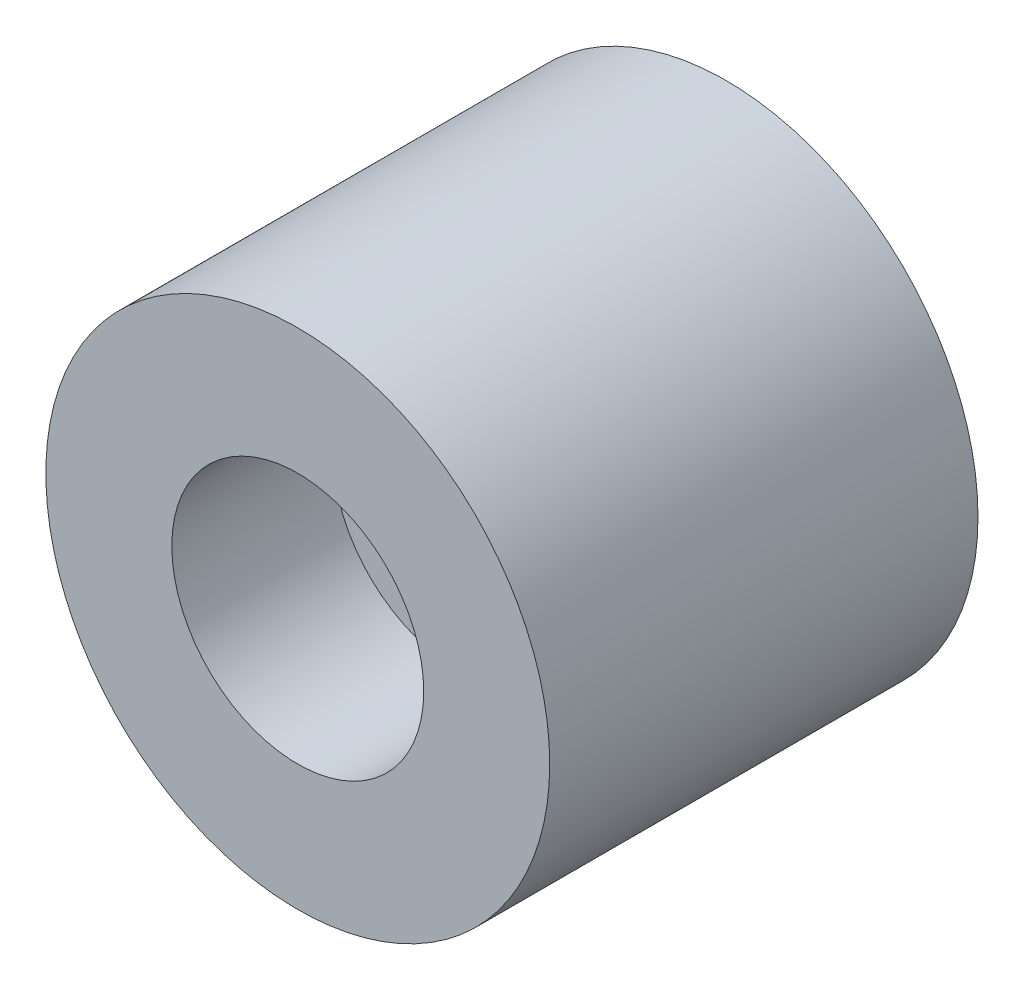
ISO-10303-21;
HEADER;
FILE_DESCRIPTION(('STEP AP214'),'2;1');
FILE_NAME('part.step','',(''),(''),'','','');
FILE_SCHEMA(('AUTOMOTIVE_DESIGN { 1 0 10303 214 1 1 1 1 }'));
ENDSEC;
DATA;
#1=APPLICATION_CONTEXT('core data for automotive mechanical design processes');
#2=APPLICATION_PROTOCOL_DEFINITION('international standard','automotive_design',2000,#1);
#3=PRODUCT_CONTEXT('',#1,'mechanical');
#4=PRODUCT('Part','Part','',(#3));
#5=PRODUCT_RELATED_PRODUCT_CATEGORY('part','',(#4));
#6=PRODUCT_DEFINITION_FORMATION('','',#4);
#7=PRODUCT_DEFINITION_CONTEXT('part definition',#1,'design');
#8=PRODUCT_DEFINITION('design','',#6,#7);
#9=PRODUCT_DEFINITION_SHAPE('','',#8);
#10=(LENGTH_UNIT() NAMED_UNIT(*) SI_UNIT(.MILLI.,.METRE.));
#11=(NAMED_UNIT(*) PLANE_ANGLE_UNIT() SI_UNIT($,.RADIAN.));
#12=(NAMED_UNIT(*) SI_UNIT($,.STERADIAN.) SOLID_ANGLE_UNIT());
#13=UNCERTAINTY_MEASURE_WITH_UNIT(LENGTH_MEASURE(1.E-05),#10,'distance_accuracy_value','');
#14=(GEOMETRIC_REPRESENTATION_CONTEXT(3) GLOBAL_UNCERTAINTY_ASSIGNED_CONTEXT((#13)) GLOBAL_UNIT_ASSIGNED_CONTEXT((#10,
#11,#12)) REPRESENTATION_CONTEXT('',''));
#15=CARTESIAN_POINT('',(0.,0.,0.));
#16=DIRECTION('',(0.,0.,1.));
#17=DIRECTION('',(1.,0.,0.));
#18=AXIS2_PLACEMENT_3D('',#15,#16,#17);
#19=CARTESIAN_POINT('',(0.,0.,0.));
#20=DIRECTION('',(0.,0.,1.));
#21=DIRECTION('',(1.,0.,0.));
#22=AXIS2_PLACEMENT_3D('',#19,#20,#21);
#23=PLANE('',#22);
#24=CARTESIAN_POINT('',(0.,0.,0.));
#25=DIRECTION('',(0.,0.,1.));
#26=DIRECTION('',(1.,0.,0.));
#27=AXIS2_PLACEMENT_3D('',#24,#25,#26);
#28=CIRCLE('',#27,5.);
#29=CARTESIAN_POINT('',(5.,0.,0.));
#30=VERTEX_POINT('',#29);
#31=EDGE_CURVE('E46',#30,#30,#28,.T.);
#32=ORIENTED_EDGE('',*,*,#31,.F.);
#33=EDGE_LOOP('',(#32));
#34=FACE_BOUND('',#33,.T.);
#35=CARTESIAN_POINT('',(0.,1.6180339887499,0.));
#36=DIRECTION('',(0.,0.,-1.));
#37=DIRECTION('',(-1.,0.,0.));
#38=AXIS2_PLACEMENT_3D('',#35,#36,#37);
#39=CIRCLE('',#38,0.500000000000004);
#40=CARTESIAN_POINT('',(0.447213595499951,1.39442719099991,0.));
#41=VERTEX_POINT('',#40);
#42=CARTESIAN_POINT('',(-0.447213595499964,1.39442719099992,0.));
#43=VERTEX_POINT('',#42);
#44=EDGE_CURVE('E54',#41,#43,#39,.T.);
#45=ORIENTED_EDGE('',*,*,#44,.T.);
#46=DIRECTION('',(-0.447213595499955,0.894427190999917,0.));
#47=VECTOR('',#46,1.);
#48=CARTESIAN_POINT('',(-0.447213595499964,1.39442719099992,0.));
#49=LINE('',#48,#47);
#50=CARTESIAN_POINT('',(-1.13593463895132,2.77186927790264,0.));
#51=VERTEX_POINT('',#50);
#52=EDGE_CURVE('E161',#43,#51,#49,.T.);
#53=ORIENTED_EDGE('',*,*,#52,.T.);
#54=CARTESIAN_POINT('',(-1.58314823445128,2.54826248015266,0.));
#55=DIRECTION('',(0.,0.,1.));
#56=DIRECTION('',(1.,0.,0.));
#57=AXIS2_PLACEMENT_3D('',#54,#55,#56);
#58=CIRCLE('',#57,0.5);
#59=CARTESIAN_POINT('',(-1.84700627352649,2.97297289351144,0.));
#60=VERTEX_POINT('',#59);
#61=EDGE_CURVE('E165',#51,#60,#58,.T.);
#62=ORIENTED_EDGE('',*,*,#61,.T.);
#63=CARTESIAN_POINT('',(0.,0.,0.));
#64=DIRECTION('',(0.,0.,1.));
#65=DIRECTION('',(1.,0.,0.));
#66=AXIS2_PLACEMENT_3D('',#63,#64,#65);
#67=CIRCLE('',#66,3.5);
#68=CARTESIAN_POINT('',(-1.84700627352649,-2.97297289351144,0.));
#69=VERTEX_POINT('',#68);
#70=EDGE_CURVE('E168',#60,#69,#67,.T.);
#71=ORIENTED_EDGE('',*,*,#70,.T.);
#72=CARTESIAN_POINT('',(-1.58314823445128,-2.54826248015266,0.));
#73=DIRECTION('',(0.,0.,-1.));
#74=DIRECTION('',(-1.,0.,0.));
#75=AXIS2_PLACEMENT_3D('',#72,#73,#74);
#76=CIRCLE('',#75,0.5);
#77=CARTESIAN_POINT('',(-1.13593463895132,-2.77186927790264,0.));
#78=VERTEX_POINT('',#77);
#79=EDGE_CURVE('E171',#78,#69,#76,.T.);
#80=ORIENTED_EDGE('',*,*,#79,.F.);
#81=DIRECTION('',(-0.447213595499961,-0.894427190999915,0.));
#82=VECTOR('',#81,1.);
#83=CARTESIAN_POINT('',(-0.447213595499953,-1.39442719099992,0.));
#84=LINE('',#83,#82);
#85=CARTESIAN_POINT('',(-0.447213595499953,-1.39442719099992,0.));
#86=VERTEX_POINT('',#85);
#87=EDGE_CURVE('E174',#86,#78,#84,.T.);
#88=ORIENTED_EDGE('',*,*,#87,.F.);
#89=CARTESIAN_POINT('',(0.,-1.6180339887499,0.));
#90=DIRECTION('',(0.,0.,1.));
#91=DIRECTION('',(1.,0.,0.));
#92=AXIS2_PLACEMENT_3D('',#89,#90,#91);
#93=CIRCLE('',#92,0.5);
#94=CARTESIAN_POINT('',(0.447213595499963,-1.39442719099992,0.));
#95=VERTEX_POINT('',#94);
#96=EDGE_CURVE('E177',#95,#86,#93,.T.);
#97=ORIENTED_EDGE('',*,*,#96,.F.);
#98=DIRECTION('',(0.447213595499956,-0.894427190999917,0.));
#99=VECTOR('',#98,1.);
#100=CARTESIAN_POINT('',(0.447213595499963,-1.39442719099992,0.));
#101=LINE('',#100,#99);
#102=CARTESIAN_POINT('',(1.13593463895132,-2.77186927790264,0.));
#103=VERTEX_POINT('',#102);
#104=EDGE_CURVE('E180',#95,#103,#101,.T.);
#105=ORIENTED_EDGE('',*,*,#104,.T.);
#106=CARTESIAN_POINT('',(1.58314823445128,-2.54826248015266,0.));
#107=DIRECTION('',(0.,0.,-1.));
#108=DIRECTION('',(-1.,0.,0.));
#109=AXIS2_PLACEMENT_3D('',#106,#107,#108);
#110=CIRCLE('',#109,0.5);
#111=CARTESIAN_POINT('',(1.84700627352649,-2.97297289351144,0.));
#112=VERTEX_POINT('',#111);
#113=EDGE_CURVE('E183',#112,#103,#110,.T.);
#114=ORIENTED_EDGE('',*,*,#113,.F.);
#115=CARTESIAN_POINT('',(0.,0.,0.));
#116=DIRECTION('',(0.,0.,1.));
#117=DIRECTION('',(1.,0.,0.));
#118=AXIS2_PLACEMENT_3D('',#115,#116,#117);
#119=CIRCLE('',#118,3.5);
#120=CARTESIAN_POINT('',(1.84700627352649,2.97297289351144,0.));
#121=VERTEX_POINT('',#120);
#122=EDGE_CURVE('E186',#112,#121,#119,.T.);
#123=ORIENTED_EDGE('',*,*,#122,.T.);
#124=CARTESIAN_POINT('',(1.58314823445128,2.54826248015266,0.));
#125=DIRECTION('',(0.,0.,1.));
#126=DIRECTION('',(1.,0.,0.));
#127=AXIS2_PLACEMENT_3D('',#124,#125,#126);
#128=CIRCLE('',#127,0.5);
#129=CARTESIAN_POINT('',(1.13593463895132,2.77186927790264,0.));
#130=VERTEX_POINT('',#129);
#131=EDGE_CURVE('E149',#121,#130,#128,.T.);
#132=ORIENTED_EDGE('',*,*,#131,.T.);
#133=DIRECTION('',(0.447213595499961,0.894427190999914,0.));
#134=VECTOR('',#133,1.);
#135=CARTESIAN_POINT('',(0.447213595499951,1.39442719099991,0.));
#136=LINE('',#135,#134);
#137=EDGE_CURVE('E189',#41,#130,#136,.T.);
#138=ORIENTED_EDGE('',*,*,#137,.F.);
#139=EDGE_LOOP('',(#45,#53,#62,#71,#80,#88,#97,#105,#114,#123,#132,#138));
#140=FACE_BOUND('',#139,.T.);
#141=ADVANCED_FACE('F37',(#34,#140),#23,.F.);
#142=CARTESIAN_POINT('',(0.,0.,8.5));
#143=DIRECTION('',(0.,0.,-1.));
#144=DIRECTION('',(-1.,0.,0.));
#145=AXIS2_PLACEMENT_3D('',#142,#143,#144);
#146=CYLINDRICAL_SURFACE('',#145,5.);
#147=CARTESIAN_POINT('',(0.,0.,8.5));
#148=DIRECTION('',(0.,0.,1.));
#149=DIRECTION('',(1.,0.,0.));
#150=AXIS2_PLACEMENT_3D('',#147,#148,#149);
#151=CIRCLE('',#150,5.);
#152=CARTESIAN_POINT('',(5.,0.,8.5));
#153=VERTEX_POINT('',#152);
#154=EDGE_CURVE('E11',#153,#153,#151,.T.);
#155=ORIENTED_EDGE('',*,*,#154,.F.);
#156=EDGE_LOOP('',(#155));
#157=FACE_BOUND('',#156,.T.);
#158=ORIENTED_EDGE('',*,*,#31,.T.);
#159=EDGE_LOOP('',(#158));
#160=FACE_BOUND('',#159,.T.);
#161=ADVANCED_FACE('F39',(#157,#160),#146,.T.);
#162=CARTESIAN_POINT('',(0.,0.,8.5));
#163=DIRECTION('',(0.,0.,1.));
#164=DIRECTION('',(1.,0.,0.));
#165=AXIS2_PLACEMENT_3D('',#162,#163,#164);
#166=PLANE('',#165);
#167=CARTESIAN_POINT('',(0.,0.,8.5));
#168=DIRECTION('',(0.,0.,1.));
#169=DIRECTION('',(1.,0.,0.));
#170=AXIS2_PLACEMENT_3D('',#167,#168,#169);
#171=CIRCLE('',#170,2.5);
#172=CARTESIAN_POINT('',(2.5,0.,8.5));
#173=VERTEX_POINT('',#172);
#174=EDGE_CURVE('E278',#173,#173,#171,.T.);
#175=ORIENTED_EDGE('',*,*,#174,.F.);
#176=EDGE_LOOP('',(#175));
#177=FACE_BOUND('',#176,.T.);
#178=ORIENTED_EDGE('',*,*,#154,.T.);
#179=EDGE_LOOP('',(#178));
#180=FACE_BOUND('',#179,.T.);
#181=ADVANCED_FACE('F268',(#177,#180),#166,.T.);
#182=CARTESIAN_POINT('',(0.,1.6180339887499,5.));
#183=DIRECTION('',(0.,0.,-1.));
#184=DIRECTION('',(-1.,0.,0.));
#185=AXIS2_PLACEMENT_3D('',#182,#183,#184);
#186=CYLINDRICAL_SURFACE('',#185,0.500000000000004);
#187=ORIENTED_EDGE('',*,*,#44,.F.);
#188=DIRECTION('',(0.,0.,-1.));
#189=VECTOR('',#188,1.);
#190=CARTESIAN_POINT('',(0.447213595499951,1.39442719099991,5.));
#191=LINE('',#190,#189);
#192=CARTESIAN_POINT('',(0.447213595499951,1.39442719099991,5.));
#193=VERTEX_POINT('',#192);
#194=EDGE_CURVE('E59',#193,#41,#191,.T.);
#195=ORIENTED_EDGE('',*,*,#194,.F.);
#196=CARTESIAN_POINT('',(0.,1.6180339887499,5.));
#197=DIRECTION('',(0.,0.,-1.));
#198=DIRECTION('',(-1.,0.,0.));
#199=AXIS2_PLACEMENT_3D('',#196,#197,#198);
#200=CIRCLE('',#199,0.500000000000004);
#201=CARTESIAN_POINT('',(-0.447213595499964,1.39442719099992,5.));
#202=VERTEX_POINT('',#201);
#203=EDGE_CURVE('E191',#193,#202,#200,.T.);
#204=ORIENTED_EDGE('',*,*,#203,.T.);
#205=DIRECTION('',(0.,0.,-1.));
#206=VECTOR('',#205,1.);
#207=CARTESIAN_POINT('',(-0.447213595499964,1.39442719099992,5.));
#208=LINE('',#207,#206);
#209=EDGE_CURVE('E209',#202,#43,#208,.T.);
#210=ORIENTED_EDGE('',*,*,#209,.T.);
#211=EDGE_LOOP('',(#187,#195,#204,#210));
#212=FACE_BOUND('',#211,.T.);
#213=ADVANCED_FACE('F264',(#212),#186,.T.);
#214=CARTESIAN_POINT('',(-0.447213595499964,1.39442719099992,5.));
#215=DIRECTION('',(-0.894427190999917,-0.447213595499955,0.));
#216=DIRECTION('',(0.447213595499955,-0.894427190999917,0.));
#217=AXIS2_PLACEMENT_3D('',#214,#215,#216);
#218=PLANE('',#217);
#219=ORIENTED_EDGE('',*,*,#52,.F.);
#220=ORIENTED_EDGE('',*,*,#209,.F.);
#221=DIRECTION('',(-0.447213595499955,0.894427190999917,0.));
#222=VECTOR('',#221,1.);
#223=CARTESIAN_POINT('',(-0.447213595499964,1.39442719099992,5.));
#224=LINE('',#223,#222);
#225=CARTESIAN_POINT('',(-1.13593463895132,2.77186927790264,5.));
#226=VERTEX_POINT('',#225);
#227=EDGE_CURVE('E109',#202,#226,#224,.T.);
#228=ORIENTED_EDGE('',*,*,#227,.T.);
#229=DIRECTION('',(0.,0.,-1.));
#230=VECTOR('',#229,1.);
#231=CARTESIAN_POINT('',(-1.13593463895132,2.77186927790264,5.));
#232=LINE('',#231,#230);
#233=EDGE_CURVE('E207',#226,#51,#232,.T.);
#234=ORIENTED_EDGE('',*,*,#233,.T.);
#235=EDGE_LOOP('',(#219,#220,#228,#234));
#236=FACE_BOUND('',#235,.T.);
#237=ADVANCED_FACE('F260',(#236),#218,.T.);
#238=CARTESIAN_POINT('',(-1.58314823445128,2.54826248015266,5.));
#239=DIRECTION('',(0.,0.,-1.));
#240=DIRECTION('',(-1.,0.,0.));
#241=AXIS2_PLACEMENT_3D('',#238,#239,#240);
#242=CYLINDRICAL_SURFACE('',#241,0.5);
#243=ORIENTED_EDGE('',*,*,#61,.F.);
#244=ORIENTED_EDGE('',*,*,#233,.F.);
#245=CARTESIAN_POINT('',(-1.58314823445128,2.54826248015266,5.));
#246=DIRECTION('',(0.,0.,1.));
#247=DIRECTION('',(1.,0.,0.));
#248=AXIS2_PLACEMENT_3D('',#245,#246,#247);
#249=CIRCLE('',#248,0.5);
#250=CARTESIAN_POINT('',(-1.84700627352649,2.97297289351144,5.));
#251=VERTEX_POINT('',#250);
#252=EDGE_CURVE('E290',#226,#251,#249,.T.);
#253=ORIENTED_EDGE('',*,*,#252,.T.);
#254=DIRECTION('',(0.,0.,-1.));
#255=VECTOR('',#254,1.);
#256=CARTESIAN_POINT('',(-1.84700627352649,2.97297289351144,5.));
#257=LINE('',#256,#255);
#258=EDGE_CURVE('E205',#251,#60,#257,.T.);
#259=ORIENTED_EDGE('',*,*,#258,.T.);
#260=EDGE_LOOP('',(#243,#244,#253,#259));
#261=FACE_BOUND('',#260,.T.);
#262=ADVANCED_FACE('F256',(#261),#242,.F.);
#263=CARTESIAN_POINT('',(0.,0.,5.));
#264=DIRECTION('',(0.,0.,-1.));
#265=DIRECTION('',(-1.,0.,0.));
#266=AXIS2_PLACEMENT_3D('',#263,#264,#265);
#267=CYLINDRICAL_SURFACE('',#266,3.5);
#268=ORIENTED_EDGE('',*,*,#70,.F.);
#269=ORIENTED_EDGE('',*,*,#258,.F.);
#270=CARTESIAN_POINT('',(0.,0.,5.));
#271=DIRECTION('',(0.,0.,1.));
#272=DIRECTION('',(1.,0.,0.));
#273=AXIS2_PLACEMENT_3D('',#270,#271,#272);
#274=CIRCLE('',#273,3.5);
#275=CARTESIAN_POINT('',(-1.84700627352649,-2.97297289351144,5.));
#276=VERTEX_POINT('',#275);
#277=EDGE_CURVE('E292',#251,#276,#274,.T.);
#278=ORIENTED_EDGE('',*,*,#277,.T.);
#279=DIRECTION('',(0.,0.,-1.));
#280=VECTOR('',#279,1.);
#281=CARTESIAN_POINT('',(-1.84700627352649,-2.97297289351144,5.));
#282=LINE('',#281,#280);
#283=EDGE_CURVE('E203',#276,#69,#282,.T.);
#284=ORIENTED_EDGE('',*,*,#283,.T.);
#285=EDGE_LOOP('',(#268,#269,#278,#284));
#286=FACE_BOUND('',#285,.T.);
#287=ADVANCED_FACE('F252',(#286),#267,.F.);
#288=CARTESIAN_POINT('',(-1.58314823445128,-2.54826248015266,5.));
#289=DIRECTION('',(0.,0.,-1.));
#290=DIRECTION('',(-1.,0.,0.));
#291=AXIS2_PLACEMENT_3D('',#288,#289,#290);
#292=CYLINDRICAL_SURFACE('',#291,0.5);
#293=ORIENTED_EDGE('',*,*,#79,.T.);
#294=ORIENTED_EDGE('',*,*,#283,.F.);
#295=CARTESIAN_POINT('',(-1.58314823445128,-2.54826248015266,5.));
#296=DIRECTION('',(0.,0.,-1.));
#297=DIRECTION('',(-1.,0.,0.));
#298=AXIS2_PLACEMENT_3D('',#295,#296,#297);
#299=CIRCLE('',#298,0.5);
#300=CARTESIAN_POINT('',(-1.13593463895132,-2.77186927790264,5.));
#301=VERTEX_POINT('',#300);
#302=EDGE_CURVE('E294',#301,#276,#299,.T.);
#303=ORIENTED_EDGE('',*,*,#302,.F.);
#304=DIRECTION('',(0.,0.,-1.));
#305=VECTOR('',#304,1.);
#306=CARTESIAN_POINT('',(-1.13593463895132,-2.77186927790264,5.));
#307=LINE('',#306,#305);
#308=EDGE_CURVE('E201',#301,#78,#307,.T.);
#309=ORIENTED_EDGE('',*,*,#308,.T.);
#310=EDGE_LOOP('',(#293,#294,#303,#309));
#311=FACE_BOUND('',#310,.T.);
#312=ADVANCED_FACE('F248',(#311),#292,.F.);
#313=CARTESIAN_POINT('',(-0.447213595499953,-1.39442719099992,5.));
#314=DIRECTION('',(0.894427190999915,-0.447213595499961,0.));
#315=DIRECTION('',(0.447213595499961,0.894427190999915,0.));
#316=AXIS2_PLACEMENT_3D('',#313,#314,#315);
#317=PLANE('',#316);
#318=ORIENTED_EDGE('',*,*,#87,.T.);
#319=ORIENTED_EDGE('',*,*,#308,.F.);
#320=DIRECTION('',(-0.447213595499961,-0.894427190999915,0.));
#321=VECTOR('',#320,1.);
#322=CARTESIAN_POINT('',(-0.447213595499953,-1.39442719099992,5.));
#323=LINE('',#322,#321);
#324=CARTESIAN_POINT('',(-0.447213595499953,-1.39442719099992,5.));
#325=VERTEX_POINT('',#324);
#326=EDGE_CURVE('E297',#325,#301,#323,.T.);
#327=ORIENTED_EDGE('',*,*,#326,.F.);
#328=DIRECTION('',(0.,0.,-1.));
#329=VECTOR('',#328,1.);
#330=CARTESIAN_POINT('',(-0.447213595499953,-1.39442719099992,5.));
#331=LINE('',#330,#329);
#332=EDGE_CURVE('E199',#325,#86,#331,.T.);
#333=ORIENTED_EDGE('',*,*,#332,.T.);
#334=EDGE_LOOP('',(#318,#319,#327,#333));
#335=FACE_BOUND('',#334,.T.);
#336=ADVANCED_FACE('F244',(#335),#317,.F.);
#337=CARTESIAN_POINT('',(0.,-1.6180339887499,5.));
#338=DIRECTION('',(0.,0.,-1.));
#339=DIRECTION('',(-1.,0.,0.));
#340=AXIS2_PLACEMENT_3D('',#337,#338,#339);
#341=CYLINDRICAL_SURFACE('',#340,0.5);
#342=ORIENTED_EDGE('',*,*,#96,.T.);
#343=ORIENTED_EDGE('',*,*,#332,.F.);
#344=CARTESIAN_POINT('',(0.,-1.6180339887499,5.));
#345=DIRECTION('',(0.,0.,1.));
#346=DIRECTION('',(1.,0.,0.));
#347=AXIS2_PLACEMENT_3D('',#344,#345,#346);
#348=CIRCLE('',#347,0.5);
#349=CARTESIAN_POINT('',(0.447213595499963,-1.39442719099992,5.));
#350=VERTEX_POINT('',#349);
#351=EDGE_CURVE('E300',#350,#325,#348,.T.);
#352=ORIENTED_EDGE('',*,*,#351,.F.);
#353=DIRECTION('',(0.,0.,-1.));
#354=VECTOR('',#353,1.);
#355=CARTESIAN_POINT('',(0.447213595499963,-1.39442719099992,5.));
#356=LINE('',#355,#354);
#357=EDGE_CURVE('E197',#350,#95,#356,.T.);
#358=ORIENTED_EDGE('',*,*,#357,.T.);
#359=EDGE_LOOP('',(#342,#343,#352,#358));
#360=FACE_BOUND('',#359,.T.);
#361=ADVANCED_FACE('F240',(#360),#341,.T.);
#362=CARTESIAN_POINT('',(0.447213595499963,-1.39442719099992,5.));
#363=DIRECTION('',(0.894427190999917,0.447213595499956,0.));
#364=DIRECTION('',(-0.447213595499956,0.894427190999917,0.));
#365=AXIS2_PLACEMENT_3D('',#362,#363,#364);
#366=PLANE('',#365);
#367=ORIENTED_EDGE('',*,*,#104,.F.);
#368=ORIENTED_EDGE('',*,*,#357,.F.);
#369=DIRECTION('',(0.447213595499956,-0.894427190999917,0.));
#370=VECTOR('',#369,1.);
#371=CARTESIAN_POINT('',(0.447213595499963,-1.39442719099992,5.));
#372=LINE('',#371,#370);
#373=CARTESIAN_POINT('',(1.13593463895132,-2.77186927790264,5.));
#374=VERTEX_POINT('',#373);
#375=EDGE_CURVE('E303',#350,#374,#372,.T.);
#376=ORIENTED_EDGE('',*,*,#375,.T.);
#377=DIRECTION('',(0.,0.,-1.));
#378=VECTOR('',#377,1.);
#379=CARTESIAN_POINT('',(1.13593463895132,-2.77186927790264,5.));
#380=LINE('',#379,#378);
#381=EDGE_CURVE('E195',#374,#103,#380,.T.);
#382=ORIENTED_EDGE('',*,*,#381,.T.);
#383=EDGE_LOOP('',(#367,#368,#376,#382));
#384=FACE_BOUND('',#383,.T.);
#385=ADVANCED_FACE('F236',(#384),#366,.T.);
#386=CARTESIAN_POINT('',(1.58314823445128,-2.54826248015266,5.));
#387=DIRECTION('',(0.,0.,-1.));
#388=DIRECTION('',(-1.,0.,0.));
#389=AXIS2_PLACEMENT_3D('',#386,#387,#388);
#390=CYLINDRICAL_SURFACE('',#389,0.5);
#391=ORIENTED_EDGE('',*,*,#113,.T.);
#392=ORIENTED_EDGE('',*,*,#381,.F.);
#393=CARTESIAN_POINT('',(1.58314823445128,-2.54826248015266,5.));
#394=DIRECTION('',(0.,0.,-1.));
#395=DIRECTION('',(-1.,0.,0.));
#396=AXIS2_PLACEMENT_3D('',#393,#394,#395);
#397=CIRCLE('',#396,0.5);
#398=CARTESIAN_POINT('',(1.84700627352649,-2.97297289351144,5.));
#399=VERTEX_POINT('',#398);
#400=EDGE_CURVE('E145',#399,#374,#397,.T.);
#401=ORIENTED_EDGE('',*,*,#400,.F.);
#402=DIRECTION('',(0.,0.,-1.));
#403=VECTOR('',#402,1.);
#404=CARTESIAN_POINT('',(1.84700627352649,-2.97297289351144,5.));
#405=LINE('',#404,#403);
#406=EDGE_CURVE('E140',#399,#112,#405,.T.);
#407=ORIENTED_EDGE('',*,*,#406,.T.);
#408=EDGE_LOOP('',(#391,#392,#401,#407));
#409=FACE_BOUND('',#408,.T.);
#410=ADVANCED_FACE('F233',(#409),#390,.F.);
#411=CARTESIAN_POINT('',(0.,0.,5.));
#412=DIRECTION('',(0.,0.,-1.));
#413=DIRECTION('',(-1.,0.,0.));
#414=AXIS2_PLACEMENT_3D('',#411,#412,#413);
#415=CYLINDRICAL_SURFACE('',#414,3.5);
#416=ORIENTED_EDGE('',*,*,#122,.F.);
#417=ORIENTED_EDGE('',*,*,#406,.F.);
#418=CARTESIAN_POINT('',(0.,0.,5.));
#419=DIRECTION('',(0.,0.,1.));
#420=DIRECTION('',(1.,0.,0.));
#421=AXIS2_PLACEMENT_3D('',#418,#419,#420);
#422=CIRCLE('',#421,3.5);
#423=CARTESIAN_POINT('',(1.84700627352649,2.97297289351144,5.));
#424=VERTEX_POINT('',#423);
#425=EDGE_CURVE('E135',#399,#424,#422,.T.);
#426=ORIENTED_EDGE('',*,*,#425,.T.);
#427=DIRECTION('',(0.,0.,-1.));
#428=VECTOR('',#427,1.);
#429=CARTESIAN_POINT('',(1.84700627352649,2.97297289351144,5.));
#430=LINE('',#429,#428);
#431=EDGE_CURVE('E139',#424,#121,#430,.T.);
#432=ORIENTED_EDGE('',*,*,#431,.T.);
#433=EDGE_LOOP('',(#416,#417,#426,#432));
#434=FACE_BOUND('',#433,.T.);
#435=ADVANCED_FACE('F138',(#434),#415,.F.);
#436=CARTESIAN_POINT('',(1.58314823445128,2.54826248015266,5.));
#437=DIRECTION('',(0.,0.,-1.));
#438=DIRECTION('',(-1.,0.,0.));
#439=AXIS2_PLACEMENT_3D('',#436,#437,#438);
#440=CYLINDRICAL_SURFACE('',#439,0.5);
#441=ORIENTED_EDGE('',*,*,#131,.F.);
#442=ORIENTED_EDGE('',*,*,#431,.F.);
#443=CARTESIAN_POINT('',(1.58314823445128,2.54826248015266,5.));
#444=DIRECTION('',(0.,0.,1.));
#445=DIRECTION('',(1.,0.,0.));
#446=AXIS2_PLACEMENT_3D('',#443,#444,#445);
#447=CIRCLE('',#446,0.5);
#448=CARTESIAN_POINT('',(1.13593463895132,2.77186927790264,5.));
#449=VERTEX_POINT('',#448);
#450=EDGE_CURVE('E144',#424,#449,#447,.T.);
#451=ORIENTED_EDGE('',*,*,#450,.T.);
#452=DIRECTION('',(0.,0.,-1.));
#453=VECTOR('',#452,1.);
#454=CARTESIAN_POINT('',(1.13593463895132,2.77186927790264,5.));
#455=LINE('',#454,#453);
#456=EDGE_CURVE('E101',#449,#130,#455,.T.);
#457=ORIENTED_EDGE('',*,*,#456,.T.);
#458=EDGE_LOOP('',(#441,#442,#451,#457));
#459=FACE_BOUND('',#458,.T.);
#460=ADVANCED_FACE('F147',(#459),#440,.F.);
#461=CARTESIAN_POINT('',(0.447213595499951,1.39442719099991,5.));
#462=DIRECTION('',(-0.894427190999914,0.447213595499961,0.));
#463=DIRECTION('',(-0.447213595499961,-0.894427190999914,0.));
#464=AXIS2_PLACEMENT_3D('',#461,#462,#463);
#465=PLANE('',#464);
#466=ORIENTED_EDGE('',*,*,#137,.T.);
#467=ORIENTED_EDGE('',*,*,#456,.F.);
#468=DIRECTION('',(0.447213595499961,0.894427190999914,0.));
#469=VECTOR('',#468,1.);
#470=CARTESIAN_POINT('',(0.447213595499951,1.39442719099991,5.));
#471=LINE('',#470,#469);
#472=EDGE_CURVE('E155',#193,#449,#471,.T.);
#473=ORIENTED_EDGE('',*,*,#472,.F.);
#474=ORIENTED_EDGE('',*,*,#194,.T.);
#475=EDGE_LOOP('',(#466,#467,#473,#474));
#476=FACE_BOUND('',#475,.T.);
#477=ADVANCED_FACE('F218',(#476),#465,.F.);
#478=CARTESIAN_POINT('',(0.,1.6180339887499,5.));
#479=DIRECTION('',(0.,0.,-1.));
#480=DIRECTION('',(-1.,0.,0.));
#481=AXIS2_PLACEMENT_3D('',#478,#479,#480);
#482=PLANE('',#481);
#483=CARTESIAN_POINT('',(0.,0.,5.));
#484=DIRECTION('',(0.,0.,-1.));
#485=DIRECTION('',(-1.,0.,0.));
#486=AXIS2_PLACEMENT_3D('',#483,#484,#485);
#487=CIRCLE('',#486,0.35);
#488=CARTESIAN_POINT('',(-0.35,0.,5.));
#489=VERTEX_POINT('',#488);
#490=EDGE_CURVE('E285',#489,#489,#487,.T.);
#491=ORIENTED_EDGE('',*,*,#490,.F.);
#492=EDGE_LOOP('',(#491));
#493=FACE_BOUND('',#492,.T.);
#494=ORIENTED_EDGE('',*,*,#203,.F.);
#495=ORIENTED_EDGE('',*,*,#472,.T.);
#496=ORIENTED_EDGE('',*,*,#450,.F.);
#497=ORIENTED_EDGE('',*,*,#425,.F.);
#498=ORIENTED_EDGE('',*,*,#400,.T.);
#499=ORIENTED_EDGE('',*,*,#375,.F.);
#500=ORIENTED_EDGE('',*,*,#351,.T.);
#501=ORIENTED_EDGE('',*,*,#326,.T.);
#502=ORIENTED_EDGE('',*,*,#302,.T.);
#503=ORIENTED_EDGE('',*,*,#277,.F.);
#504=ORIENTED_EDGE('',*,*,#252,.F.);
#505=ORIENTED_EDGE('',*,*,#227,.F.);
#506=EDGE_LOOP('',(#494,#495,#496,#497,#498,#499,#500,#501,#502,#503,#504,#505));
#507=FACE_BOUND('',#506,.T.);
#508=ADVANCED_FACE('F153',(#493,#507),#482,.T.);
#509=CARTESIAN_POINT('',(0.,0.,5.3));
#510=DIRECTION('',(0.,0.,1.));
#511=DIRECTION('',(1.,0.,0.));
#512=AXIS2_PLACEMENT_3D('',#509,#510,#511);
#513=CYLINDRICAL_SURFACE('',#512,2.5);
#514=CARTESIAN_POINT('',(0.,0.,5.3));
#515=DIRECTION('',(0.,0.,1.));
#516=DIRECTION('',(1.,0.,0.));
#517=AXIS2_PLACEMENT_3D('',#514,#515,#516);
#518=CIRCLE('',#517,2.5);
#519=CARTESIAN_POINT('',(2.5,0.,5.3));
#520=VERTEX_POINT('',#519);
#521=EDGE_CURVE('E162',#520,#520,#518,.T.);
#522=ORIENTED_EDGE('',*,*,#521,.F.);
#523=EDGE_LOOP('',(#522));
#524=FACE_BOUND('',#523,.T.);
#525=ORIENTED_EDGE('',*,*,#174,.T.);
#526=EDGE_LOOP('',(#525));
#527=FACE_BOUND('',#526,.T.);
#528=ADVANCED_FACE('F225',(#524,#527),#513,.F.);
#529=CARTESIAN_POINT('',(0.,0.,5.3));
#530=DIRECTION('',(0.,0.,1.));
#531=DIRECTION('',(1.,0.,0.));
#532=AXIS2_PLACEMENT_3D('',#529,#530,#531);
#533=PLANE('',#532);
#534=CARTESIAN_POINT('',(0.,0.,5.3));
#535=DIRECTION('',(0.,0.,1.));
#536=DIRECTION('',(1.,0.,0.));
#537=AXIS2_PLACEMENT_3D('',#534,#535,#536);
#538=CIRCLE('',#537,0.35);
#539=CARTESIAN_POINT('',(0.35,0.,5.3));
#540=VERTEX_POINT('',#539);
#541=EDGE_CURVE('E41',#540,#540,#538,.T.);
#542=ORIENTED_EDGE('',*,*,#541,.F.);
#543=EDGE_LOOP('',(#542));
#544=FACE_BOUND('',#543,.T.);
#545=ORIENTED_EDGE('',*,*,#521,.T.);
#546=EDGE_LOOP('',(#545));
#547=FACE_BOUND('',#546,.T.);
#548=ADVANCED_FACE('F326',(#544,#547),#533,.T.);
#549=CARTESIAN_POINT('',(0.,0.,6.));
#550=DIRECTION('',(0.,0.,-1.));
#551=DIRECTION('',(-1.,0.,0.));
#552=AXIS2_PLACEMENT_3D('',#549,#550,#551);
#553=CYLINDRICAL_SURFACE('',#552,0.35);
#554=ORIENTED_EDGE('',*,*,#541,.T.);
#555=EDGE_LOOP('',(#554));
#556=FACE_BOUND('',#555,.T.);
#557=ORIENTED_EDGE('',*,*,#490,.T.);
#558=EDGE_LOOP('',(#557));
#559=FACE_BOUND('',#558,.T.);
#560=ADVANCED_FACE('F324',(#556,#559),#553,.F.);
#561=CLOSED_SHELL('',(#141,#161,#181,#213,#237,#262,#287,#312,#336,#361,#385,#410,#435,#460,
#477,#508,#528,#548,#560));
#562=MANIFOLD_SOLID_BREP('B2',#561);
#563=ADVANCED_BREP_SHAPE_REPRESENTATION('',(#18,#562),#14);
#564=SHAPE_DEFINITION_REPRESENTATION(#9,#563);
ENDSEC;
END-ISO-10303-21;
